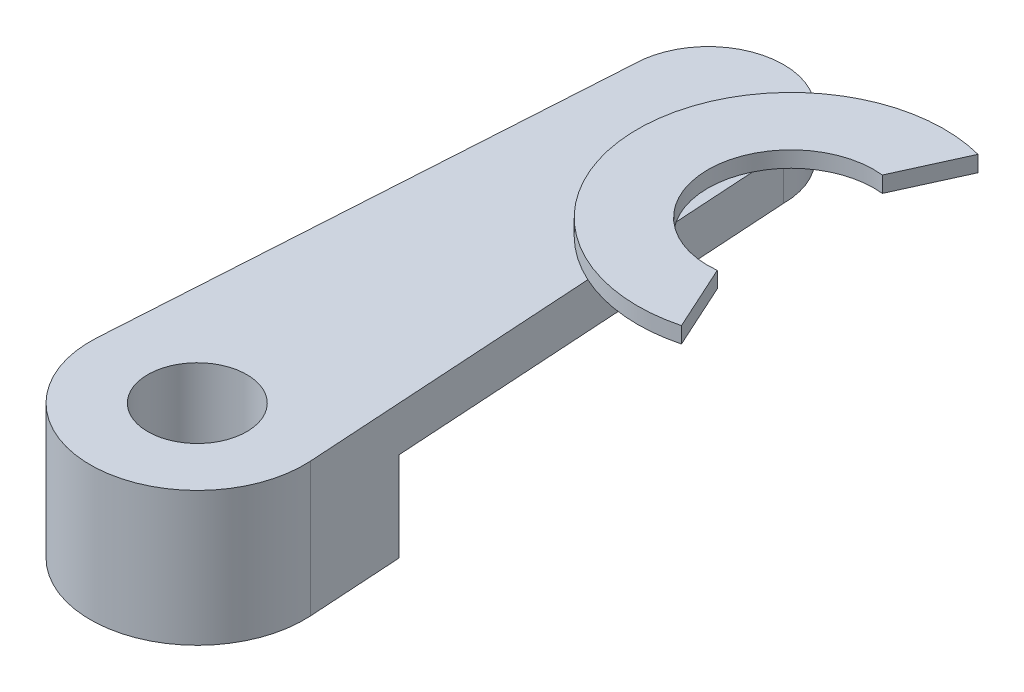
ISO-10303-21;
HEADER;
FILE_DESCRIPTION(('STEP AP214'),'2;1');
FILE_NAME('part.step','',(''),(''),'','','');
FILE_SCHEMA(('AUTOMOTIVE_DESIGN { 1 0 10303 214 1 1 1 1 }'));
ENDSEC;
DATA;
#1=APPLICATION_CONTEXT('core data for automotive mechanical design processes');
#2=APPLICATION_PROTOCOL_DEFINITION('international standard','automotive_design',2000,#1);
#3=PRODUCT_CONTEXT('',#1,'mechanical');
#4=PRODUCT('Part','Part','',(#3));
#5=PRODUCT_RELATED_PRODUCT_CATEGORY('part','',(#4));
#6=PRODUCT_DEFINITION_FORMATION('','',#4);
#7=PRODUCT_DEFINITION_CONTEXT('part definition',#1,'design');
#8=PRODUCT_DEFINITION('design','',#6,#7);
#9=PRODUCT_DEFINITION_SHAPE('','',#8);
#10=(LENGTH_UNIT() NAMED_UNIT(*) SI_UNIT(.MILLI.,.METRE.));
#11=(NAMED_UNIT(*) PLANE_ANGLE_UNIT() SI_UNIT($,.RADIAN.));
#12=(NAMED_UNIT(*) SI_UNIT($,.STERADIAN.) SOLID_ANGLE_UNIT());
#13=UNCERTAINTY_MEASURE_WITH_UNIT(LENGTH_MEASURE(1.E-05),#10,'distance_accuracy_value','');
#14=(GEOMETRIC_REPRESENTATION_CONTEXT(3) GLOBAL_UNCERTAINTY_ASSIGNED_CONTEXT((#13)) GLOBAL_UNIT_ASSIGNED_CONTEXT((#10,
#11,#12)) REPRESENTATION_CONTEXT('',''));
#15=CARTESIAN_POINT('',(0.,0.,0.));
#16=DIRECTION('',(0.,0.,1.));
#17=DIRECTION('',(1.,0.,0.));
#18=AXIS2_PLACEMENT_3D('',#15,#16,#17);
#19=CARTESIAN_POINT('',(0.,4.2,0.));
#20=DIRECTION('',(0.,1.,0.));
#21=DIRECTION('',(0.,0.,1.));
#22=AXIS2_PLACEMENT_3D('',#19,#20,#21);
#23=PLANE('',#22);
#24=CARTESIAN_POINT('',(4.76345704229943,4.2,-13.8267716310872));
#25=DIRECTION('',(0.,-1.,0.));
#26=DIRECTION('',(0.,0.,-1.));
#27=AXIS2_PLACEMENT_3D('',#24,#25,#26);
#28=CIRCLE('',#27,2.6);
#29=CARTESIAN_POINT('',(2.58482426415073,4.2,-12.4077722590027));
#30=VERTEX_POINT('',#29);
#31=CARTESIAN_POINT('',(2.42579476927111,4.2,-14.9648995225212));
#32=VERTEX_POINT('',#31);
#33=EDGE_CURVE('E164',#30,#32,#28,.T.);
#34=ORIENTED_EDGE('',*,*,#33,.F.);
#35=DIRECTION('',(-0.0620707653760194,0.,-0.998071750970658));
#36=VECTOR('',#35,1.);
#37=CARTESIAN_POINT('',(3.3435403657517,4.2,-0.207937064009665));
#38=LINE('',#37,#36);
#39=EDGE_CURVE('E245',#30,#32,#38,.T.);
#40=ORIENTED_EDGE('',*,*,#39,.T.);
#41=EDGE_LOOP('',(#34,#40));
#42=FACE_BOUND('',#41,.T.);
#43=ADVANCED_FACE('F36',(#42),#23,.T.);
#44=CARTESIAN_POINT('',(0.,4.2,0.));
#45=DIRECTION('',(0.,-1.,0.));
#46=DIRECTION('',(0.,0.,-1.));
#47=AXIS2_PLACEMENT_3D('',#44,#45,#46);
#48=CYLINDRICAL_SURFACE('',#47,3.35);
#49=CARTESIAN_POINT('',(0.,0.,0.));
#50=DIRECTION('',(0.,1.,0.));
#51=DIRECTION('',(0.,0.,1.));
#52=AXIS2_PLACEMENT_3D('',#49,#50,#51);
#53=CIRCLE('',#52,3.35);
#54=CARTESIAN_POINT('',(-3.3435403657517,0.,-0.207937064009665));
#55=VERTEX_POINT('',#54);
#56=CARTESIAN_POINT('',(3.3435403657517,0.,-0.207937064009665));
#57=VERTEX_POINT('',#56);
#58=EDGE_CURVE('E185',#55,#57,#53,.T.);
#59=ORIENTED_EDGE('',*,*,#58,.T.);
#60=DIRECTION('',(0.,-1.,0.));
#61=VECTOR('',#60,1.);
#62=CARTESIAN_POINT('',(3.3435403657517,4.2,-0.207937064009665));
#63=LINE('',#62,#61);
#64=CARTESIAN_POINT('',(3.3435403657517,4.2,-0.207937064009665));
#65=VERTEX_POINT('',#64);
#66=EDGE_CURVE('E216',#65,#57,#63,.T.);
#67=ORIENTED_EDGE('',*,*,#66,.F.);
#68=CARTESIAN_POINT('',(0.,4.2,0.));
#69=DIRECTION('',(0.,1.,0.));
#70=DIRECTION('',(0.,0.,1.));
#71=AXIS2_PLACEMENT_3D('',#68,#69,#70);
#72=CIRCLE('',#71,3.35);
#73=CARTESIAN_POINT('',(-3.3435403657517,4.2,-0.207937064009665));
#74=VERTEX_POINT('',#73);
#75=EDGE_CURVE('E188',#74,#65,#72,.T.);
#76=ORIENTED_EDGE('',*,*,#75,.F.);
#77=DIRECTION('',(0.,-1.,0.));
#78=VECTOR('',#77,1.);
#79=CARTESIAN_POINT('',(-3.3435403657517,4.2,-0.207937064009665));
#80=LINE('',#79,#78);
#81=EDGE_CURVE('E204',#74,#55,#80,.T.);
#82=ORIENTED_EDGE('',*,*,#81,.T.);
#83=EDGE_LOOP('',(#59,#67,#76,#82));
#84=FACE_BOUND('',#83,.T.);
#85=ADVANCED_FACE('F38',(#84),#48,.T.);
#86=CARTESIAN_POINT('',(3.3435403657517,4.2,-0.207937064009665));
#87=DIRECTION('',(-0.998071750970658,0.,0.0620707653760194));
#88=DIRECTION('',(0.0620707653760194,0.,0.998071750970658));
#89=AXIS2_PLACEMENT_3D('',#86,#87,#88);
#90=PLANE('',#89);
#91=DIRECTION('',(0.,1.,0.));
#92=VECTOR('',#91,1.);
#93=CARTESIAN_POINT('',(3.16029473073457,4.2,-3.15444965639244));
#94=LINE('',#93,#92);
#95=CARTESIAN_POINT('',(3.16029473073457,0.,-3.15444965639244));
#96=VERTEX_POINT('',#95);
#97=CARTESIAN_POINT('',(3.16029473073457,2.8,-3.15444965639244));
#98=VERTEX_POINT('',#97);
#99=EDGE_CURVE('E51',#96,#98,#94,.T.);
#100=ORIENTED_EDGE('',*,*,#99,.T.);
#101=DIRECTION('',(-0.0620707653760194,0.,-0.998071750970658));
#102=VECTOR('',#101,1.);
#103=CARTESIAN_POINT('',(3.3435403657517,2.8,-0.207937064009665));
#104=LINE('',#103,#102);
#105=CARTESIAN_POINT('',(2.36142116204727,2.8,-16.));
#106=VERTEX_POINT('',#105);
#107=EDGE_CURVE('E125',#98,#106,#104,.T.);
#108=ORIENTED_EDGE('',*,*,#107,.T.);
#109=DIRECTION('',(0.,-1.,0.));
#110=VECTOR('',#109,1.);
#111=CARTESIAN_POINT('',(2.36142116204727,4.2,-16.));
#112=LINE('',#111,#110);
#113=CARTESIAN_POINT('',(2.36142116204727,4.2,-16.));
#114=VERTEX_POINT('',#113);
#115=EDGE_CURVE('E214',#114,#106,#112,.T.);
#116=ORIENTED_EDGE('',*,*,#115,.F.);
#117=EDGE_CURVE('E191',#32,#114,#38,.T.);
#118=ORIENTED_EDGE('',*,*,#117,.F.);
#119=ORIENTED_EDGE('',*,*,#39,.F.);
#120=CARTESIAN_POINT('',(2.76807529086401,4.2,-9.46117297041775));
#121=VERTEX_POINT('',#120);
#122=EDGE_CURVE('E197',#121,#30,#38,.T.);
#123=ORIENTED_EDGE('',*,*,#122,.F.);
#124=EDGE_CURVE('E193',#65,#121,#38,.T.);
#125=ORIENTED_EDGE('',*,*,#124,.F.);
#126=ORIENTED_EDGE('',*,*,#66,.T.);
#127=DIRECTION('',(-0.0620707653760194,0.,-0.998071750970658));
#128=VECTOR('',#127,1.);
#129=CARTESIAN_POINT('',(3.3435403657517,0.,-0.207937064009665));
#130=LINE('',#129,#128);
#131=EDGE_CURVE('E143',#57,#96,#130,.T.);
#132=ORIENTED_EDGE('',*,*,#131,.T.);
#133=EDGE_LOOP('',(#100,#108,#116,#118,#119,#123,#125,#126,#132));
#134=FACE_BOUND('',#133,.T.);
#135=ADVANCED_FACE('F141',(#134),#90,.F.);
#136=CARTESIAN_POINT('',(0.,4.2,-16.));
#137=DIRECTION('',(0.,-1.,0.));
#138=DIRECTION('',(0.,0.,-1.));
#139=AXIS2_PLACEMENT_3D('',#136,#137,#138);
#140=CYLINDRICAL_SURFACE('',#139,2.36142116204727);
#141=CARTESIAN_POINT('',(0.,2.8,-16.));
#142=DIRECTION('',(0.,1.,0.));
#143=DIRECTION('',(0.,0.,1.));
#144=AXIS2_PLACEMENT_3D('',#141,#142,#143);
#145=CIRCLE('',#144,2.36142116204727);
#146=CARTESIAN_POINT('',(-2.36142116204727,2.8,-16.));
#147=VERTEX_POINT('',#146);
#148=EDGE_CURVE('E130',#147,#106,#145,.F.);
#149=ORIENTED_EDGE('',*,*,#148,.F.);
#150=DIRECTION('',(0.,-1.,0.));
#151=VECTOR('',#150,1.);
#152=CARTESIAN_POINT('',(-2.36142116204727,4.2,-16.));
#153=LINE('',#152,#151);
#154=CARTESIAN_POINT('',(-2.36142116204727,4.2,-16.));
#155=VERTEX_POINT('',#154);
#156=EDGE_CURVE('E211',#155,#147,#153,.T.);
#157=ORIENTED_EDGE('',*,*,#156,.F.);
#158=CARTESIAN_POINT('',(0.,4.2,-16.));
#159=DIRECTION('',(0.,1.,0.));
#160=DIRECTION('',(0.,0.,1.));
#161=AXIS2_PLACEMENT_3D('',#158,#159,#160);
#162=CIRCLE('',#161,2.36142116204727);
#163=CARTESIAN_POINT('',(1.7617657925677,4.2,-17.5724157200636));
#164=VERTEX_POINT('',#163);
#165=EDGE_CURVE('E198',#155,#164,#162,.F.);
#166=ORIENTED_EDGE('',*,*,#165,.T.);
#167=EDGE_CURVE('E196',#164,#114,#162,.F.);
#168=ORIENTED_EDGE('',*,*,#167,.T.);
#169=ORIENTED_EDGE('',*,*,#115,.T.);
#170=EDGE_LOOP('',(#149,#157,#166,#168,#169));
#171=FACE_BOUND('',#170,.T.);
#172=ADVANCED_FACE('F250',(#171),#140,.T.);
#173=CARTESIAN_POINT('',(-3.3435403657517,4.2,-0.207937064009665));
#174=DIRECTION('',(-0.998071750970658,0.,-0.0620707653760194));
#175=DIRECTION('',(-0.0620707653760194,0.,0.998071750970658));
#176=AXIS2_PLACEMENT_3D('',#173,#174,#175);
#177=PLANE('',#176);
#178=DIRECTION('',(0.0620707653760194,0.,-0.998071750970658));
#179=VECTOR('',#178,1.);
#180=CARTESIAN_POINT('',(-3.3435403657517,2.8,-0.207937064009665));
#181=LINE('',#180,#179);
#182=CARTESIAN_POINT('',(-3.16029473073457,2.8,-3.15444965639244));
#183=VERTEX_POINT('',#182);
#184=EDGE_CURVE('E12',#183,#147,#181,.T.);
#185=ORIENTED_EDGE('',*,*,#184,.F.);
#186=DIRECTION('',(0.,1.,0.));
#187=VECTOR('',#186,1.);
#188=CARTESIAN_POINT('',(-3.16029473073457,4.2,-3.15444965639244));
#189=LINE('',#188,#187);
#190=CARTESIAN_POINT('',(-3.16029473073457,0.,-3.15444965639244));
#191=VERTEX_POINT('',#190);
#192=EDGE_CURVE('E138',#191,#183,#189,.T.);
#193=ORIENTED_EDGE('',*,*,#192,.F.);
#194=DIRECTION('',(0.0620707653760194,0.,-0.998071750970658));
#195=VECTOR('',#194,1.);
#196=CARTESIAN_POINT('',(-3.3435403657517,0.,-0.207937064009665));
#197=LINE('',#196,#195);
#198=EDGE_CURVE('E192',#55,#191,#197,.T.);
#199=ORIENTED_EDGE('',*,*,#198,.F.);
#200=ORIENTED_EDGE('',*,*,#81,.F.);
#201=DIRECTION('',(0.0620707653760194,0.,-0.998071750970658));
#202=VECTOR('',#201,1.);
#203=CARTESIAN_POINT('',(-3.3435403657517,4.2,-0.207937064009665));
#204=LINE('',#203,#202);
#205=EDGE_CURVE('E201',#74,#155,#204,.T.);
#206=ORIENTED_EDGE('',*,*,#205,.T.);
#207=ORIENTED_EDGE('',*,*,#156,.T.);
#208=EDGE_LOOP('',(#185,#193,#199,#200,#206,#207));
#209=FACE_BOUND('',#208,.T.);
#210=ADVANCED_FACE('F256',(#209),#177,.T.);
#211=CARTESIAN_POINT('',(0.,4.2,0.));
#212=DIRECTION('',(0.,1.,0.));
#213=DIRECTION('',(0.,0.,1.));
#214=AXIS2_PLACEMENT_3D('',#211,#212,#213);
#215=CIRCLE('',#214,1.55003090181125);
#216=CARTESIAN_POINT('',(0.,4.2,1.55003090181125));
#217=VERTEX_POINT('',#216);
#218=EDGE_CURVE('E181',#217,#217,#215,.T.);
#219=ORIENTED_EDGE('',*,*,#218,.F.);
#220=EDGE_LOOP('',(#219));
#221=FACE_BOUND('',#220,.T.);
#222=ORIENTED_EDGE('',*,*,#124,.T.);
#223=CARTESIAN_POINT('',(4.76345704229943,4.2,-13.8267716310872));
#224=DIRECTION('',(0.,-1.,0.));
#225=DIRECTION('',(0.,0.,-1.));
#226=AXIS2_PLACEMENT_3D('',#223,#224,#225);
#227=CIRCLE('',#226,4.8);
#228=EDGE_CURVE('E170',#121,#164,#227,.T.);
#229=ORIENTED_EDGE('',*,*,#228,.T.);
#230=ORIENTED_EDGE('',*,*,#165,.F.);
#231=ORIENTED_EDGE('',*,*,#205,.F.);
#232=ORIENTED_EDGE('',*,*,#75,.T.);
#233=EDGE_LOOP('',(#222,#229,#230,#231,#232));
#234=FACE_BOUND('',#233,.T.);
#235=ADVANCED_FACE('F254',(#221,#234),#23,.T.);
#236=CARTESIAN_POINT('',(0.,0.,0.));
#237=DIRECTION('',(0.,1.,0.));
#238=DIRECTION('',(0.,0.,1.));
#239=AXIS2_PLACEMENT_3D('',#236,#237,#238);
#240=PLANE('',#239);
#241=CARTESIAN_POINT('',(0.,0.,0.));
#242=DIRECTION('',(0.,1.,0.));
#243=DIRECTION('',(0.,0.,1.));
#244=AXIS2_PLACEMENT_3D('',#241,#242,#243);
#245=CIRCLE('',#244,1.55003090181125);
#246=CARTESIAN_POINT('',(0.,0.,1.55003090181125));
#247=VERTEX_POINT('',#246);
#248=EDGE_CURVE('E182',#247,#247,#245,.T.);
#249=ORIENTED_EDGE('',*,*,#248,.T.);
#250=EDGE_LOOP('',(#249));
#251=FACE_BOUND('',#250,.T.);
#252=ORIENTED_EDGE('',*,*,#198,.T.);
#253=DIRECTION('',(1.,0.,0.));
#254=VECTOR('',#253,1.);
#255=CARTESIAN_POINT('',(0.,0.,-3.15444965639244));
#256=LINE('',#255,#254);
#257=EDGE_CURVE('E44',#191,#96,#256,.T.);
#258=ORIENTED_EDGE('',*,*,#257,.T.);
#259=ORIENTED_EDGE('',*,*,#131,.F.);
#260=ORIENTED_EDGE('',*,*,#58,.F.);
#261=EDGE_LOOP('',(#252,#258,#259,#260));
#262=FACE_BOUND('',#261,.T.);
#263=ADVANCED_FACE('F262',(#251,#262),#240,.F.);
#264=CARTESIAN_POINT('',(0.,0.,0.));
#265=DIRECTION('',(0.,1.,0.));
#266=DIRECTION('',(0.,0.,1.));
#267=AXIS2_PLACEMENT_3D('',#264,#265,#266);
#268=CYLINDRICAL_SURFACE('',#267,1.55003090181125);
#269=ORIENTED_EDGE('',*,*,#248,.F.);
#270=EDGE_LOOP('',(#269));
#271=FACE_BOUND('',#270,.T.);
#272=ORIENTED_EDGE('',*,*,#218,.T.);
#273=EDGE_LOOP('',(#272));
#274=FACE_BOUND('',#273,.T.);
#275=ADVANCED_FACE('F264',(#271,#274),#268,.F.);
#276=CARTESIAN_POINT('',(4.76345704229943,4.2,-13.8267716310872));
#277=DIRECTION('',(0.,-1.,0.));
#278=DIRECTION('',(0.,0.,-1.));
#279=AXIS2_PLACEMENT_3D('',#276,#277,#278);
#280=PLANE('',#279);
#281=CARTESIAN_POINT('',(5.97884530369824,4.2,-9.18319204481387));
#282=VERTEX_POINT('',#281);
#283=EDGE_CURVE('E167',#282,#121,#227,.T.);
#284=ORIENTED_EDGE('',*,*,#283,.T.);
#285=ORIENTED_EDGE('',*,*,#122,.T.);
#286=CARTESIAN_POINT('',(5.040969256896,4.2,-11.2416242521647));
#287=VERTEX_POINT('',#286);
#288=EDGE_CURVE('E160',#287,#30,#28,.T.);
#289=ORIENTED_EDGE('',*,*,#288,.F.);
#290=DIRECTION('',(-0.414617996307905,0.,-0.909995558855986));
#291=VECTOR('',#290,1.);
#292=CARTESIAN_POINT('',(5.97884530369824,4.2,-9.18319204481387));
#293=LINE('',#292,#291);
#294=EDGE_CURVE('E152',#282,#287,#293,.T.);
#295=ORIENTED_EDGE('',*,*,#294,.F.);
#296=EDGE_LOOP('',(#284,#285,#289,#295));
#297=FACE_BOUND('',#296,.T.);
#298=ADVANCED_FACE('F241',(#297),#280,.T.);
#299=CARTESIAN_POINT('',(4.76345704229943,4.7,-13.8267716310872));
#300=DIRECTION('',(0.,-1.,0.));
#301=DIRECTION('',(0.,0.,-1.));
#302=AXIS2_PLACEMENT_3D('',#299,#300,#301);
#303=CYLINDRICAL_SURFACE('',#302,2.6);
#304=ORIENTED_EDGE('',*,*,#288,.T.);
#305=ORIENTED_EDGE('',*,*,#33,.T.);
#306=CARTESIAN_POINT('',(5.03954515130713,4.2,-16.4120714891432));
#307=VERTEX_POINT('',#306);
#308=EDGE_CURVE('E134',#32,#307,#28,.T.);
#309=ORIENTED_EDGE('',*,*,#308,.T.);
#310=DIRECTION('',(0.,-1.,0.));
#311=VECTOR('',#310,1.);
#312=CARTESIAN_POINT('',(5.03954515130713,4.7,-16.4120714891432));
#313=LINE('',#312,#311);
#314=CARTESIAN_POINT('',(5.03954515130713,4.7,-16.4120714891432));
#315=VERTEX_POINT('',#314);
#316=EDGE_CURVE('E178',#315,#307,#313,.T.);
#317=ORIENTED_EDGE('',*,*,#316,.F.);
#318=CARTESIAN_POINT('',(4.76345704229943,4.7,-13.8267716310872));
#319=DIRECTION('',(0.,-1.,0.));
#320=DIRECTION('',(0.,0.,-1.));
#321=AXIS2_PLACEMENT_3D('',#318,#319,#320);
#322=CIRCLE('',#321,2.6);
#323=CARTESIAN_POINT('',(5.040969256896,4.7,-11.2416242521647));
#324=VERTEX_POINT('',#323);
#325=EDGE_CURVE('E148',#324,#315,#322,.T.);
#326=ORIENTED_EDGE('',*,*,#325,.F.);
#327=DIRECTION('',(0.,-1.,0.));
#328=VECTOR('',#327,1.);
#329=CARTESIAN_POINT('',(5.040969256896,4.7,-11.2416242521647));
#330=LINE('',#329,#328);
#331=EDGE_CURVE('E159',#324,#287,#330,.T.);
#332=ORIENTED_EDGE('',*,*,#331,.T.);
#333=EDGE_LOOP('',(#304,#305,#309,#317,#326,#332));
#334=FACE_BOUND('',#333,.T.);
#335=ADVANCED_FACE('F225',(#334),#303,.F.);
#336=CARTESIAN_POINT('',(5.03954515130713,4.7,-16.4120714891432));
#337=DIRECTION('',(-0.910223818731279,0.,-0.414116650008482));
#338=DIRECTION('',(-0.414116650008482,0.,0.910223818731279));
#339=AXIS2_PLACEMENT_3D('',#336,#337,#338);
#340=PLANE('',#339);
#341=DIRECTION('',(0.414116650008482,0.,-0.910223818731279));
#342=VECTOR('',#341,1.);
#343=CARTESIAN_POINT('',(5.03954515130713,4.2,-16.4120714891432));
#344=LINE('',#343,#342);
#345=CARTESIAN_POINT('',(5.97628714052006,4.2,-18.4710200259138));
#346=VERTEX_POINT('',#345);
#347=EDGE_CURVE('E163',#307,#346,#344,.T.);
#348=ORIENTED_EDGE('',*,*,#347,.T.);
#349=DIRECTION('',(0.,-1.,0.));
#350=VECTOR('',#349,1.);
#351=CARTESIAN_POINT('',(5.97628714052006,4.7,-18.4710200259138));
#352=LINE('',#351,#350);
#353=CARTESIAN_POINT('',(5.97628714052006,4.7,-18.4710200259138));
#354=VERTEX_POINT('',#353);
#355=EDGE_CURVE('E176',#354,#346,#352,.T.);
#356=ORIENTED_EDGE('',*,*,#355,.F.);
#357=DIRECTION('',(0.414116650008482,0.,-0.910223818731279));
#358=VECTOR('',#357,1.);
#359=CARTESIAN_POINT('',(5.03954515130713,4.7,-16.4120714891432));
#360=LINE('',#359,#358);
#361=EDGE_CURVE('E151',#315,#354,#360,.T.);
#362=ORIENTED_EDGE('',*,*,#361,.F.);
#363=ORIENTED_EDGE('',*,*,#316,.T.);
#364=EDGE_LOOP('',(#348,#356,#362,#363));
#365=FACE_BOUND('',#364,.T.);
#366=ADVANCED_FACE('F231',(#365),#340,.F.);
#367=CARTESIAN_POINT('',(4.76345704229943,4.7,-13.8267716310872));
#368=DIRECTION('',(0.,-1.,0.));
#369=DIRECTION('',(0.,0.,-1.));
#370=AXIS2_PLACEMENT_3D('',#367,#368,#369);
#371=CYLINDRICAL_SURFACE('',#370,4.8);
#372=ORIENTED_EDGE('',*,*,#283,.F.);
#373=DIRECTION('',(0.,-1.,0.));
#374=VECTOR('',#373,1.);
#375=CARTESIAN_POINT('',(5.97884530369824,4.7,-9.18319204481387));
#376=LINE('',#375,#374);
#377=CARTESIAN_POINT('',(5.97884530369824,4.7,-9.18319204481387));
#378=VERTEX_POINT('',#377);
#379=EDGE_CURVE('E174',#378,#282,#376,.T.);
#380=ORIENTED_EDGE('',*,*,#379,.F.);
#381=CARTESIAN_POINT('',(4.76345704229943,4.7,-13.8267716310872));
#382=DIRECTION('',(0.,-1.,0.));
#383=DIRECTION('',(0.,0.,-1.));
#384=AXIS2_PLACEMENT_3D('',#381,#382,#383);
#385=CIRCLE('',#384,4.8);
#386=EDGE_CURVE('E154',#378,#354,#385,.T.);
#387=ORIENTED_EDGE('',*,*,#386,.T.);
#388=ORIENTED_EDGE('',*,*,#355,.T.);
#389=EDGE_CURVE('E59',#164,#346,#227,.T.);
#390=ORIENTED_EDGE('',*,*,#389,.F.);
#391=ORIENTED_EDGE('',*,*,#228,.F.);
#392=EDGE_LOOP('',(#372,#380,#387,#388,#390,#391));
#393=FACE_BOUND('',#392,.T.);
#394=ADVANCED_FACE('F285',(#393),#371,.T.);
#395=CARTESIAN_POINT('',(5.97884530369824,4.7,-9.18319204481387));
#396=DIRECTION('',(-0.909995558855986,0.,0.414617996307905));
#397=DIRECTION('',(0.414617996307905,0.,0.909995558855986));
#398=AXIS2_PLACEMENT_3D('',#395,#396,#397);
#399=PLANE('',#398);
#400=ORIENTED_EDGE('',*,*,#294,.T.);
#401=ORIENTED_EDGE('',*,*,#331,.F.);
#402=DIRECTION('',(-0.414617996307905,0.,-0.909995558855986));
#403=VECTOR('',#402,1.);
#404=CARTESIAN_POINT('',(5.97884530369824,4.7,-9.18319204481387));
#405=LINE('',#404,#403);
#406=EDGE_CURVE('E157',#378,#324,#405,.T.);
#407=ORIENTED_EDGE('',*,*,#406,.F.);
#408=ORIENTED_EDGE('',*,*,#379,.T.);
#409=EDGE_LOOP('',(#400,#401,#407,#408));
#410=FACE_BOUND('',#409,.T.);
#411=ADVANCED_FACE('F288',(#410),#399,.F.);
#412=CARTESIAN_POINT('',(4.76345704229943,4.7,-13.8267716310872));
#413=DIRECTION('',(0.,-1.,0.));
#414=DIRECTION('',(0.,0.,-1.));
#415=AXIS2_PLACEMENT_3D('',#412,#413,#414);
#416=PLANE('',#415);
#417=ORIENTED_EDGE('',*,*,#325,.T.);
#418=ORIENTED_EDGE('',*,*,#361,.T.);
#419=ORIENTED_EDGE('',*,*,#386,.F.);
#420=ORIENTED_EDGE('',*,*,#406,.T.);
#421=EDGE_LOOP('',(#417,#418,#419,#420));
#422=FACE_BOUND('',#421,.T.);
#423=ADVANCED_FACE('F234',(#422),#416,.F.);
#424=ORIENTED_EDGE('',*,*,#308,.F.);
#425=ORIENTED_EDGE('',*,*,#117,.T.);
#426=ORIENTED_EDGE('',*,*,#167,.F.);
#427=ORIENTED_EDGE('',*,*,#389,.T.);
#428=ORIENTED_EDGE('',*,*,#347,.F.);
#429=EDGE_LOOP('',(#424,#425,#426,#427,#428));
#430=FACE_BOUND('',#429,.T.);
#431=ADVANCED_FACE('F228',(#430),#280,.T.);
#432=CARTESIAN_POINT('',(0.,2.8,0.));
#433=DIRECTION('',(0.,1.,0.));
#434=DIRECTION('',(0.,0.,1.));
#435=AXIS2_PLACEMENT_3D('',#432,#433,#434);
#436=PLANE('',#435);
#437=DIRECTION('',(-1.,0.,0.));
#438=VECTOR('',#437,1.);
#439=CARTESIAN_POINT('',(7.77149626625828,2.8,-3.15444965639244));
#440=LINE('',#439,#438);
#441=EDGE_CURVE('E127',#98,#183,#440,.T.);
#442=ORIENTED_EDGE('',*,*,#441,.T.);
#443=ORIENTED_EDGE('',*,*,#184,.T.);
#444=ORIENTED_EDGE('',*,*,#148,.T.);
#445=ORIENTED_EDGE('',*,*,#107,.F.);
#446=EDGE_LOOP('',(#442,#443,#444,#445));
#447=FACE_BOUND('',#446,.T.);
#448=ADVANCED_FACE('F126',(#447),#436,.F.);
#449=CARTESIAN_POINT('',(7.77149626625828,28.283386978334,-3.15444965639244));
#450=DIRECTION('',(0.,0.,1.));
#451=DIRECTION('',(1.,0.,0.));
#452=AXIS2_PLACEMENT_3D('',#449,#450,#451);
#453=PLANE('',#452);
#454=ORIENTED_EDGE('',*,*,#257,.F.);
#455=ORIENTED_EDGE('',*,*,#192,.T.);
#456=ORIENTED_EDGE('',*,*,#441,.F.);
#457=ORIENTED_EDGE('',*,*,#99,.F.);
#458=EDGE_LOOP('',(#454,#455,#456,#457));
#459=FACE_BOUND('',#458,.T.);
#460=ADVANCED_FACE('F136',(#459),#453,.F.);
#461=CLOSED_SHELL('',(#43,#85,#135,#172,#210,#235,#263,#275,#298,#335,#366,#394,#411,#423,#431,
#448,#460));
#462=MANIFOLD_SOLID_BREP('B2',#461);
#463=ADVANCED_BREP_SHAPE_REPRESENTATION('',(#18,#462),#14);
#464=SHAPE_DEFINITION_REPRESENTATION(#9,#463);
ENDSEC;
END-ISO-10303-21;
